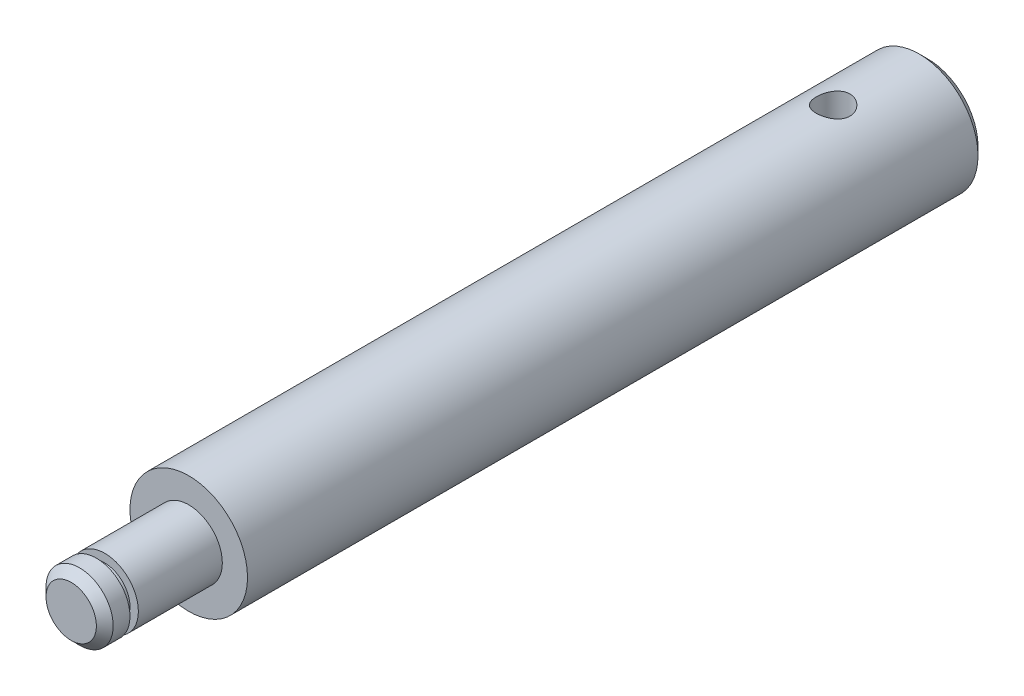
ISO-10303-21;
HEADER;
FILE_DESCRIPTION(('STEP AP214'),'2;1');
FILE_NAME('part.step','',(''),(''),'','','');
FILE_SCHEMA(('AUTOMOTIVE_DESIGN { 1 0 10303 214 1 1 1 1 }'));
ENDSEC;
DATA;
#1=APPLICATION_CONTEXT('core data for automotive mechanical design processes');
#2=APPLICATION_PROTOCOL_DEFINITION('international standard','automotive_design',2000,#1);
#3=PRODUCT_CONTEXT('',#1,'mechanical');
#4=PRODUCT('Part','Part','',(#3));
#5=PRODUCT_RELATED_PRODUCT_CATEGORY('part','',(#4));
#6=PRODUCT_DEFINITION_FORMATION('','',#4);
#7=PRODUCT_DEFINITION_CONTEXT('part definition',#1,'design');
#8=PRODUCT_DEFINITION('design','',#6,#7);
#9=PRODUCT_DEFINITION_SHAPE('','',#8);
#10=(LENGTH_UNIT() NAMED_UNIT(*) SI_UNIT(.MILLI.,.METRE.));
#11=(NAMED_UNIT(*) PLANE_ANGLE_UNIT() SI_UNIT($,.RADIAN.));
#12=(NAMED_UNIT(*) SI_UNIT($,.STERADIAN.) SOLID_ANGLE_UNIT());
#13=UNCERTAINTY_MEASURE_WITH_UNIT(LENGTH_MEASURE(1.E-05),#10,'distance_accuracy_value','');
#14=(GEOMETRIC_REPRESENTATION_CONTEXT(3) GLOBAL_UNCERTAINTY_ASSIGNED_CONTEXT((#13)) GLOBAL_UNIT_ASSIGNED_CONTEXT((#10,
#11,#12)) REPRESENTATION_CONTEXT('',''));
#15=CARTESIAN_POINT('',(0.,0.,0.));
#16=DIRECTION('',(0.,0.,1.));
#17=DIRECTION('',(1.,0.,0.));
#18=AXIS2_PLACEMENT_3D('',#15,#16,#17);
#19=CARTESIAN_POINT('',(0.,0.,44.));
#20=DIRECTION('',(0.,0.,-1.));
#21=DIRECTION('',(-1.,0.,0.));
#22=AXIS2_PLACEMENT_3D('',#19,#20,#21);
#23=CYLINDRICAL_SURFACE('',#22,3.5);
#24=CARTESIAN_POINT('',(0.,-3.5,6.62499999999999));
#25=CARTESIAN_POINT('',(0.0549774511886257,-3.49999934647171,6.62499903021902));
#26=CARTESIAN_POINT('',(0.109964873936291,-3.49869208701023,6.62045110551193));
#27=CARTESIAN_POINT('',(0.218345995598493,-3.4936045297255,6.60241786494884));
#28=CARTESIAN_POINT('',(0.271739083414806,-3.48982329605034,6.58892916696295));
#29=CARTESIAN_POINT('',(0.375352150368933,-3.48020345674544,6.55349598079174));
#30=CARTESIAN_POINT('',(0.425576440424111,-3.474367720532,6.53156328192401));
#31=CARTESIAN_POINT('',(0.521634380564631,-3.46124989158242,6.47991100426083));
#32=CARTESIAN_POINT('',(0.567467570589073,-3.45396764753901,6.45019061075485));
#33=CARTESIAN_POINT('',(0.654647223429474,-3.43852367312903,6.3829824946635));
#34=CARTESIAN_POINT('',(0.695861861190485,-3.4303452097302,6.34532762307221));
#35=CARTESIAN_POINT('',(0.77148567896215,-3.41413367457396,6.2636761284313));
#36=CARTESIAN_POINT('',(0.805893838538833,-3.40610062478085,6.21967855618443));
#37=CARTESIAN_POINT('',(0.867598950032222,-3.39091507439313,6.12550320860398));
#38=CARTESIAN_POINT('',(0.894739105517022,-3.38378351259109,6.07521900746546));
#39=CARTESIAN_POINT('',(0.940125852769608,-3.37145671914236,5.97056399412672));
#40=CARTESIAN_POINT('',(0.958374357777517,-3.36626107099664,5.9161940639724));
#41=CARTESIAN_POINT('',(0.984992165068869,-3.35856804120241,5.80638261841595));
#42=CARTESIAN_POINT('',(0.993602766016068,-3.35600489366891,5.75100431860089));
#43=CARTESIAN_POINT('',(1.00145333894794,-3.35367104182518,5.63953442575838));
#44=CARTESIAN_POINT('',(1.00069534704802,-3.35389973075334,5.58344299036685));
#45=CARTESIAN_POINT('',(0.990020673813946,-3.35706517184156,5.4740656942732));
#46=CARTESIAN_POINT('',(0.980401628641798,-3.35991391343389,5.42074782440997));
#47=CARTESIAN_POINT('',(0.95275693042909,-3.36785674196985,5.31651639018586));
#48=CARTESIAN_POINT('',(0.934730517406282,-3.37295103189706,5.26560304363966));
#49=CARTESIAN_POINT('',(0.890553405689013,-3.38488431756517,5.16687687778419));
#50=CARTESIAN_POINT('',(0.86430275586439,-3.39174458202416,5.11911146379919));
#51=CARTESIAN_POINT('',(0.804491895839429,-3.40642608441438,5.02856171939328));
#52=CARTESIAN_POINT('',(0.770930058366721,-3.41424753611068,4.98577850113254));
#53=CARTESIAN_POINT('',(0.695951998365096,-3.43033125328062,4.90471381219683));
#54=CARTESIAN_POINT('',(0.654287437422658,-3.43859902286152,4.86666276201639));
#55=CARTESIAN_POINT('',(0.565066141193109,-3.45438123609203,4.79803699817986));
#56=CARTESIAN_POINT('',(0.517509100740942,-3.46189564068921,4.76746267197915));
#57=CARTESIAN_POINT('',(0.417461536545719,-3.47538264032743,4.71453563261299));
#58=CARTESIAN_POINT('',(0.364944908904999,-3.48134637748612,4.69222985659791));
#59=CARTESIAN_POINT('',(0.256696614983732,-3.49099625743795,4.6568330542916));
#60=CARTESIAN_POINT('',(0.200965762905071,-3.49468297428128,4.64373970537737));
#61=CARTESIAN_POINT('',(0.0898331943221739,-3.49927437257336,4.62751335714528));
#62=CARTESIAN_POINT('',(0.0344806734302531,-3.50026636425301,4.6240676523135));
#63=CARTESIAN_POINT('',(-0.0760132634027908,-3.49961042353544,4.62636363315053));
#64=CARTESIAN_POINT('',(-0.131154703878552,-3.49796280790309,4.63210421642296));
#65=CARTESIAN_POINT('',(-0.238509316715158,-3.49226963342609,4.65235522215814));
#66=CARTESIAN_POINT('',(-0.290759105867426,-3.48827306508862,4.66668659066172));
#67=CARTESIAN_POINT('',(-0.392104343102812,-3.4783399937092,4.70350025099233));
#68=CARTESIAN_POINT('',(-0.441199425624334,-3.47240326632855,4.72598348544462));
#69=CARTESIAN_POINT('',(-0.536020842560034,-3.45904980584657,4.77901166832263));
#70=CARTESIAN_POINT('',(-0.581651243270123,-3.45160381589488,4.8097205994129));
#71=CARTESIAN_POINT('',(-0.66721926402965,-3.43608973548903,4.87812625297533));
#72=CARTESIAN_POINT('',(-0.70715558542121,-3.42802150376367,4.91582456503144));
#73=CARTESIAN_POINT('',(-0.781553214170348,-3.41184309815947,4.9986046710256));
#74=CARTESIAN_POINT('',(-0.815792713704764,-3.40374018433795,5.04388763778285));
#75=CARTESIAN_POINT('',(-0.876197658032574,-3.38869447362751,5.13973129430901));
#76=CARTESIAN_POINT('',(-0.902363383738848,-3.3817516363796,5.19029180037321));
#77=CARTESIAN_POINT('',(-0.945687270594165,-3.36989325638715,5.29504560549588));
#78=CARTESIAN_POINT('',(-0.96289316621221,-3.36496700079019,5.34921788178635));
#79=CARTESIAN_POINT('',(-0.987897250353697,-3.35771228398835,5.4598549678272));
#80=CARTESIAN_POINT('',(-0.995698289511603,-3.35538303564047,5.51631907755101));
#81=CARTESIAN_POINT('',(-1.00149012123095,-3.35365851547576,5.62764801646077));
#82=CARTESIAN_POINT('',(-0.999840138221134,-3.35415580399703,5.68249275227629));
#83=CARTESIAN_POINT('',(-0.987623554788207,-3.35777298607399,5.79108736533289));
#84=CARTESIAN_POINT('',(-0.977057251899594,-3.36089279211717,5.8448372790465));
#85=CARTESIAN_POINT('',(-0.947529844083134,-3.36933488579116,5.94918918558376));
#86=CARTESIAN_POINT('',(-0.928655458931756,-3.37463438524179,5.99981769350544));
#87=CARTESIAN_POINT('',(-0.883114746507961,-3.38683651421364,6.09722936724624));
#88=CARTESIAN_POINT('',(-0.85644704021577,-3.3937394274128,6.14401185063665));
#89=CARTESIAN_POINT('',(-0.795032732674117,-3.40865834474881,6.23409176090262));
#90=CARTESIAN_POINT('',(-0.760046138613649,-3.41670381589509,6.27722069567096));
#91=CARTESIAN_POINT('',(-0.683429920189671,-3.43284922546139,6.35711194790491));
#92=CARTESIAN_POINT('',(-0.641798625364273,-3.4409491770859,6.3938726595554));
#93=CARTESIAN_POINT('',(-0.551787160432689,-3.45653979786176,6.4609185921633));
#94=CARTESIAN_POINT('',(-0.503261251179884,-3.46400950518705,6.49101349363481));
#95=CARTESIAN_POINT('',(-0.401625264823326,-3.47725697888987,6.542572892511));
#96=CARTESIAN_POINT('',(-0.348517712057365,-3.48303566935144,6.56404210596653));
#97=CARTESIAN_POINT('',(-0.246458157667514,-3.49163672362654,6.59542377569772));
#98=CARTESIAN_POINT('',(-0.197881503812192,-3.49474842181038,6.60648676834227));
#99=CARTESIAN_POINT('',(-0.0995391843931819,-3.49893021926074,6.62127482862106));
#100=CARTESIAN_POINT('',(-0.0497736788080448,-3.50000059166998,6.62500087798843));
#101=CARTESIAN_POINT('',(0.,-3.5,6.62499999999999));
#102=B_SPLINE_CURVE_WITH_KNOTS('',3,(#24,#25,#26,#27,#28,#29,#30,#31,#32,#33,#34,#35,#36,#37,
#38,#39,#40,#41,#42,#43,#44,#45,#46,#47,#48,#49,#50,#51,#52,#53,#54,#55,#56,#57,#58,#59,#60,#61,
#62,#63,#64,#65,#66,#67,#68,#69,#70,#71,#72,#73,#74,#75,#76,#77,#78,#79,#80,#81,#82,#83,#84,#85,
#86,#87,#88,#89,#90,#91,#92,#93,#94,#95,#96,#97,#98,#99,#100,#101),.UNSPECIFIED.,.T.,.F.,(4,2,2,
2,2,2,2,2,2,2,2,2,2,2,2,2,2,2,2,2,2,2,2,2,2,2,2,2,2,2,2,2,2,2,2,2,2,2,4),(0.,0.164749656271171,
0.329561669897588,0.494144406447668,0.658744367717574,0.827239057653901,0.99575898936856,
1.16766537650028,1.33953475772404,1.50699754929407,1.67442394611626,1.83642392910676,
1.99843855889073,2.16250401641615,2.32660602784681,2.4968925029726,2.66718780073734,
2.83843550548233,3.00964002003315,3.17522728845109,3.34079468713333,3.50302570235768,
3.66527548283773,3.83103762668234,3.99683751589902,4.16806052438175,4.33927757478657,
4.50957286677745,4.67981652887077,4.84363340801446,5.00744482086199,5.16958548138841,
5.33175484991997,5.4993382843839,5.66696391547445,5.8388898947829,6.01072174610252,
6.15989734012181,6.30905297207067),.UNSPECIFIED.);
#103=CARTESIAN_POINT('',(0.,-3.5,6.62499999999999));
#104=VERTEX_POINT('',#103);
#105=EDGE_CURVE('E10',#104,#104,#102,.T.);
#106=ORIENTED_EDGE('',*,*,#105,.T.);
#107=EDGE_LOOP('',(#106));
#108=FACE_BOUND('',#107,.T.);
#109=CARTESIAN_POINT('',(0.,3.5,6.62499999999999));
#110=CARTESIAN_POINT('',(-0.0549774511886252,3.49999934647171,6.62499903021902));
#111=CARTESIAN_POINT('',(-0.10996487393629,3.49869208701023,6.62045110551193));
#112=CARTESIAN_POINT('',(-0.218345995598493,3.4936045297255,6.60241786494884));
#113=CARTESIAN_POINT('',(-0.271739083414805,3.48982329605034,6.58892916696295));
#114=CARTESIAN_POINT('',(-0.375352150368933,3.48020345674544,6.55349598079174));
#115=CARTESIAN_POINT('',(-0.42557644042411,3.474367720532,6.53156328192401));
#116=CARTESIAN_POINT('',(-0.52163438056463,3.46124989158242,6.47991100426083));
#117=CARTESIAN_POINT('',(-0.567467570589073,3.45396764753901,6.45019061075485));
#118=CARTESIAN_POINT('',(-0.654647223429473,3.43852367312903,6.3829824946635));
#119=CARTESIAN_POINT('',(-0.695861861190484,3.4303452097302,6.34532762307221));
#120=CARTESIAN_POINT('',(-0.771485678962149,3.41413367457396,6.2636761284313));
#121=CARTESIAN_POINT('',(-0.805893838538832,3.40610062478085,6.21967855618443));
#122=CARTESIAN_POINT('',(-0.867598950032221,3.39091507439313,6.12550320860398));
#123=CARTESIAN_POINT('',(-0.894739105517021,3.38378351259109,6.07521900746546));
#124=CARTESIAN_POINT('',(-0.940125852769607,3.37145671914236,5.97056399412672));
#125=CARTESIAN_POINT('',(-0.958374357777516,3.36626107099664,5.9161940639724));
#126=CARTESIAN_POINT('',(-0.984992165068868,3.35856804120241,5.80638261841595));
#127=CARTESIAN_POINT('',(-0.993602766016067,3.35600489366891,5.75100431860089));
#128=CARTESIAN_POINT('',(-1.00145333894794,3.35367104182518,5.63953442575838));
#129=CARTESIAN_POINT('',(-1.00069534704802,3.35389973075334,5.58344299036685));
#130=CARTESIAN_POINT('',(-0.990020673813944,3.35706517184156,5.4740656942732));
#131=CARTESIAN_POINT('',(-0.980401628641797,3.35991391343389,5.42074782440997));
#132=CARTESIAN_POINT('',(-0.952756930429089,3.36785674196985,5.31651639018586));
#133=CARTESIAN_POINT('',(-0.934730517406281,3.37295103189706,5.26560304363966));
#134=CARTESIAN_POINT('',(-0.890553405689012,3.38488431756517,5.16687687778419));
#135=CARTESIAN_POINT('',(-0.864302755864389,3.39174458202416,5.11911146379919));
#136=CARTESIAN_POINT('',(-0.804491895839428,3.40642608441438,5.02856171939328));
#137=CARTESIAN_POINT('',(-0.770930058366721,3.41424753611068,4.98577850113254));
#138=CARTESIAN_POINT('',(-0.695951998365096,3.43033125328062,4.90471381219683));
#139=CARTESIAN_POINT('',(-0.654287437422658,3.43859902286152,4.86666276201639));
#140=CARTESIAN_POINT('',(-0.565066141193109,3.45438123609203,4.79803699817986));
#141=CARTESIAN_POINT('',(-0.517509100740942,3.46189564068921,4.76746267197915));
#142=CARTESIAN_POINT('',(-0.417461536545719,3.47538264032743,4.71453563261299));
#143=CARTESIAN_POINT('',(-0.364944908904999,3.48134637748612,4.69222985659791));
#144=CARTESIAN_POINT('',(-0.256696614983732,3.49099625743795,4.6568330542916));
#145=CARTESIAN_POINT('',(-0.200965762905071,3.49468297428128,4.64373970537737));
#146=CARTESIAN_POINT('',(-0.0898331943221731,3.49927437257336,4.62751335714528));
#147=CARTESIAN_POINT('',(-0.0344806734302523,3.50026636425301,4.6240676523135));
#148=CARTESIAN_POINT('',(0.0760132634027915,3.49961042353544,4.62636363315053));
#149=CARTESIAN_POINT('',(0.131154703878552,3.49796280790309,4.63210421642296));
#150=CARTESIAN_POINT('',(0.238509316715158,3.49226963342609,4.65235522215814));
#151=CARTESIAN_POINT('',(0.290759105867426,3.48827306508862,4.66668659066172));
#152=CARTESIAN_POINT('',(0.392104343102813,3.4783399937092,4.70350025099233));
#153=CARTESIAN_POINT('',(0.441199425624335,3.47240326632854,4.72598348544461));
#154=CARTESIAN_POINT('',(0.536020842560035,3.45904980584657,4.77901166832263));
#155=CARTESIAN_POINT('',(0.581651243270124,3.45160381589488,4.8097205994129));
#156=CARTESIAN_POINT('',(0.667219264029651,3.43608973548903,4.87812625297533));
#157=CARTESIAN_POINT('',(0.70715558542121,3.42802150376367,4.91582456503144));
#158=CARTESIAN_POINT('',(0.781553214170348,3.41184309815947,4.9986046710256));
#159=CARTESIAN_POINT('',(0.815792713704765,3.40374018433795,5.04388763778285));
#160=CARTESIAN_POINT('',(0.876197658032575,3.38869447362751,5.13973129430901));
#161=CARTESIAN_POINT('',(0.902363383738849,3.3817516363796,5.19029180037321));
#162=CARTESIAN_POINT('',(0.945687270594166,3.36989325638715,5.29504560549588));
#163=CARTESIAN_POINT('',(0.96289316621221,3.36496700079018,5.34921788178635));
#164=CARTESIAN_POINT('',(0.987897250353698,3.35771228398835,5.4598549678272));
#165=CARTESIAN_POINT('',(0.995698289511604,3.35538303564047,5.51631907755101));
#166=CARTESIAN_POINT('',(1.00149012123095,3.35365851547576,5.62764801646077));
#167=CARTESIAN_POINT('',(0.999840138221135,3.35415580399703,5.68249275227629));
#168=CARTESIAN_POINT('',(0.987623554788208,3.35777298607399,5.79108736533289));
#169=CARTESIAN_POINT('',(0.977057251899595,3.36089279211717,5.8448372790465));
#170=CARTESIAN_POINT('',(0.947529844083135,3.36933488579116,5.94918918558376));
#171=CARTESIAN_POINT('',(0.928655458931757,3.37463438524179,5.99981769350544));
#172=CARTESIAN_POINT('',(0.883114746507963,3.38683651421364,6.09722936724624));
#173=CARTESIAN_POINT('',(0.856447040215771,3.3937394274128,6.14401185063665));
#174=CARTESIAN_POINT('',(0.795032732674118,3.40865834474881,6.23409176090262));
#175=CARTESIAN_POINT('',(0.76004613861365,3.41670381589509,6.27722069567096));
#176=CARTESIAN_POINT('',(0.683429920189673,3.43284922546139,6.35711194790491));
#177=CARTESIAN_POINT('',(0.641798625364275,3.4409491770859,6.3938726595554));
#178=CARTESIAN_POINT('',(0.551787160432691,3.45653979786176,6.4609185921633));
#179=CARTESIAN_POINT('',(0.503261251179886,3.46400950518705,6.49101349363481));
#180=CARTESIAN_POINT('',(0.401625264823327,3.47725697888987,6.542572892511));
#181=CARTESIAN_POINT('',(0.348517712057366,3.48303566935144,6.56404210596653));
#182=CARTESIAN_POINT('',(0.246458157667515,3.49163672362654,6.59542377569772));
#183=CARTESIAN_POINT('',(0.197881503812193,3.49474842181038,6.60648676834227));
#184=CARTESIAN_POINT('',(0.0995391843931827,3.49893021926074,6.62127482862106));
#185=CARTESIAN_POINT('',(0.0497736788080455,3.50000059166998,6.62500087798843));
#186=CARTESIAN_POINT('',(0.,3.5,6.62499999999999));
#187=B_SPLINE_CURVE_WITH_KNOTS('',3,(#109,#110,#111,#112,#113,#114,#115,#116,#117,#118,#119,
#120,#121,#122,#123,#124,#125,#126,#127,#128,#129,#130,#131,#132,#133,#134,#135,#136,#137,#138,
#139,#140,#141,#142,#143,#144,#145,#146,#147,#148,#149,#150,#151,#152,#153,#154,#155,#156,#157,
#158,#159,#160,#161,#162,#163,#164,#165,#166,#167,#168,#169,#170,#171,#172,#173,#174,#175,#176,
#177,#178,#179,#180,#181,#182,#183,#184,#185,#186),.UNSPECIFIED.,.T.,.F.,(4,2,2,2,2,2,2,2,2,2,2,
2,2,2,2,2,2,2,2,2,2,2,2,2,2,2,2,2,2,2,2,2,2,2,2,2,2,2,4),(0.,0.164749656271171,
0.329561669897588,0.494144406447667,0.658744367717574,0.827239057653901,0.99575898936856,
1.16766537650028,1.33953475772404,1.50699754929407,1.67442394611626,1.83642392910676,
1.99843855889073,2.16250401641614,2.32660602784681,2.4968925029726,2.66718780073733,
2.83843550548233,3.00964002003315,3.17522728845109,3.34079468713333,3.50302570235768,
3.66527548283773,3.83103762668234,3.99683751589902,4.16806052438175,4.33927757478657,
4.50957286677745,4.67981652887077,4.84363340801446,5.00744482086199,5.16958548138841,
5.33175484991997,5.4993382843839,5.66696391547445,5.8388898947829,6.01072174610252,
6.15989734012181,6.30905297207067),.UNSPECIFIED.);
#188=CARTESIAN_POINT('',(0.,3.5,6.62499999999999));
#189=VERTEX_POINT('',#188);
#190=EDGE_CURVE('E64',#189,#189,#187,.T.);
#191=ORIENTED_EDGE('',*,*,#190,.T.);
#192=EDGE_LOOP('',(#191));
#193=FACE_BOUND('',#192,.T.);
#194=CARTESIAN_POINT('',(0.,0.,0.5));
#195=DIRECTION('',(0.,0.,1.));
#196=DIRECTION('',(1.,0.,0.));
#197=AXIS2_PLACEMENT_3D('',#194,#195,#196);
#198=CIRCLE('',#197,3.5);
#199=CARTESIAN_POINT('',(3.5,0.,0.5));
#200=VERTEX_POINT('',#199);
#201=EDGE_CURVE('E72',#200,#200,#198,.T.);
#202=ORIENTED_EDGE('',*,*,#201,.T.);
#203=EDGE_LOOP('',(#202));
#204=FACE_BOUND('',#203,.T.);
#205=CARTESIAN_POINT('',(0.,0.,44.));
#206=DIRECTION('',(0.,0.,1.));
#207=DIRECTION('',(1.,0.,0.));
#208=AXIS2_PLACEMENT_3D('',#205,#206,#207);
#209=CIRCLE('',#208,3.5);
#210=CARTESIAN_POINT('',(3.5,0.,44.));
#211=VERTEX_POINT('',#210);
#212=EDGE_CURVE('E131',#211,#211,#209,.T.);
#213=ORIENTED_EDGE('',*,*,#212,.F.);
#214=EDGE_LOOP('',(#213));
#215=FACE_BOUND('',#214,.T.);
#216=ADVANCED_FACE('F51',(#108,#193,#204,#215),#23,.T.);
#217=CARTESIAN_POINT('',(0.,0.,44.));
#218=DIRECTION('',(0.,0.,1.));
#219=DIRECTION('',(1.,0.,0.));
#220=AXIS2_PLACEMENT_3D('',#217,#218,#219);
#221=PLANE('',#220);
#222=CARTESIAN_POINT('',(0.,0.,44.));
#223=DIRECTION('',(0.,0.,1.));
#224=DIRECTION('',(1.,0.,0.));
#225=AXIS2_PLACEMENT_3D('',#222,#223,#224);
#226=CIRCLE('',#225,2.);
#227=CARTESIAN_POINT('',(2.,0.,44.));
#228=VERTEX_POINT('',#227);
#229=EDGE_CURVE('E133',#228,#228,#226,.T.);
#230=ORIENTED_EDGE('',*,*,#229,.F.);
#231=EDGE_LOOP('',(#230));
#232=FACE_BOUND('',#231,.T.);
#233=ORIENTED_EDGE('',*,*,#212,.T.);
#234=EDGE_LOOP('',(#233));
#235=FACE_BOUND('',#234,.T.);
#236=ADVANCED_FACE('F112',(#232,#235),#221,.T.);
#237=CARTESIAN_POINT('',(0.,0.,0.));
#238=DIRECTION('',(0.,0.,1.));
#239=DIRECTION('',(1.,0.,0.));
#240=AXIS2_PLACEMENT_3D('',#237,#238,#239);
#241=PLANE('',#240);
#242=CARTESIAN_POINT('',(0.,0.,0.));
#243=DIRECTION('',(0.,0.,1.));
#244=DIRECTION('',(1.,0.,0.));
#245=AXIS2_PLACEMENT_3D('',#242,#243,#244);
#246=CIRCLE('',#245,3.);
#247=CARTESIAN_POINT('',(3.,0.,0.));
#248=VERTEX_POINT('',#247);
#249=EDGE_CURVE('E68',#248,#248,#246,.F.);
#250=ORIENTED_EDGE('',*,*,#249,.T.);
#251=EDGE_LOOP('',(#250));
#252=FACE_BOUND('',#251,.T.);
#253=ADVANCED_FACE('F110',(#252),#241,.F.);
#254=CARTESIAN_POINT('',(0.,0.,49.));
#255=DIRECTION('',(0.,0.,-1.));
#256=DIRECTION('',(-1.,0.,0.));
#257=AXIS2_PLACEMENT_3D('',#254,#255,#256);
#258=CYLINDRICAL_SURFACE('',#257,2.);
#259=CARTESIAN_POINT('',(0.,0.,49.));
#260=DIRECTION('',(0.,0.,1.));
#261=DIRECTION('',(1.,0.,0.));
#262=AXIS2_PLACEMENT_3D('',#259,#260,#261);
#263=CIRCLE('',#262,2.);
#264=CARTESIAN_POINT('',(2.,0.,49.));
#265=VERTEX_POINT('',#264);
#266=EDGE_CURVE('E134',#265,#265,#263,.T.);
#267=ORIENTED_EDGE('',*,*,#266,.F.);
#268=EDGE_LOOP('',(#267));
#269=FACE_BOUND('',#268,.T.);
#270=ORIENTED_EDGE('',*,*,#229,.T.);
#271=EDGE_LOOP('',(#270));
#272=FACE_BOUND('',#271,.T.);
#273=ADVANCED_FACE('F106',(#269,#272),#258,.T.);
#274=CARTESIAN_POINT('',(0.,0.,49.));
#275=DIRECTION('',(0.,0.,1.));
#276=DIRECTION('',(1.,0.,0.));
#277=AXIS2_PLACEMENT_3D('',#274,#275,#276);
#278=PLANE('',#277);
#279=CARTESIAN_POINT('',(0.,0.,49.));
#280=DIRECTION('',(0.,0.,1.));
#281=DIRECTION('',(1.,0.,0.));
#282=AXIS2_PLACEMENT_3D('',#279,#280,#281);
#283=CIRCLE('',#282,1.5);
#284=CARTESIAN_POINT('',(1.5,0.,49.));
#285=VERTEX_POINT('',#284);
#286=EDGE_CURVE('E137',#285,#285,#283,.T.);
#287=ORIENTED_EDGE('',*,*,#286,.F.);
#288=EDGE_LOOP('',(#287));
#289=FACE_BOUND('',#288,.T.);
#290=ORIENTED_EDGE('',*,*,#266,.T.);
#291=EDGE_LOOP('',(#290));
#292=FACE_BOUND('',#291,.T.);
#293=ADVANCED_FACE('F102',(#289,#292),#278,.T.);
#294=CARTESIAN_POINT('',(0.,0.,49.5));
#295=DIRECTION('',(0.,0.,-1.));
#296=DIRECTION('',(-1.,0.,0.));
#297=AXIS2_PLACEMENT_3D('',#294,#295,#296);
#298=CYLINDRICAL_SURFACE('',#297,1.5);
#299=CARTESIAN_POINT('',(0.,0.,49.5));
#300=DIRECTION('',(0.,0.,1.));
#301=DIRECTION('',(1.,0.,0.));
#302=AXIS2_PLACEMENT_3D('',#299,#300,#301);
#303=CIRCLE('',#302,1.5);
#304=CARTESIAN_POINT('',(1.5,0.,49.5));
#305=VERTEX_POINT('',#304);
#306=EDGE_CURVE('E140',#305,#305,#303,.T.);
#307=ORIENTED_EDGE('',*,*,#306,.F.);
#308=EDGE_LOOP('',(#307));
#309=FACE_BOUND('',#308,.T.);
#310=ORIENTED_EDGE('',*,*,#286,.T.);
#311=EDGE_LOOP('',(#310));
#312=FACE_BOUND('',#311,.T.);
#313=ADVANCED_FACE('F98',(#309,#312),#298,.T.);
#314=CARTESIAN_POINT('',(0.,0.,51.));
#315=DIRECTION('',(0.,0.,-1.));
#316=DIRECTION('',(-1.,0.,0.));
#317=AXIS2_PLACEMENT_3D('',#314,#315,#316);
#318=CYLINDRICAL_SURFACE('',#317,2.);
#319=CARTESIAN_POINT('',(0.,0.,50.5));
#320=DIRECTION('',(0.,0.,1.));
#321=DIRECTION('',(1.,0.,0.));
#322=AXIS2_PLACEMENT_3D('',#319,#320,#321);
#323=CIRCLE('',#322,2.);
#324=CARTESIAN_POINT('',(2.,0.,50.5));
#325=VERTEX_POINT('',#324);
#326=EDGE_CURVE('E146',#325,#325,#323,.F.);
#327=ORIENTED_EDGE('',*,*,#326,.T.);
#328=EDGE_LOOP('',(#327));
#329=FACE_BOUND('',#328,.T.);
#330=CARTESIAN_POINT('',(0.,0.,49.5));
#331=DIRECTION('',(0.,0.,1.));
#332=DIRECTION('',(1.,0.,0.));
#333=AXIS2_PLACEMENT_3D('',#330,#331,#332);
#334=CIRCLE('',#333,2.);
#335=CARTESIAN_POINT('',(2.,0.,49.5));
#336=VERTEX_POINT('',#335);
#337=EDGE_CURVE('E240',#336,#336,#334,.T.);
#338=ORIENTED_EDGE('',*,*,#337,.T.);
#339=EDGE_LOOP('',(#338));
#340=FACE_BOUND('',#339,.T.);
#341=ADVANCED_FACE('F90',(#329,#340),#318,.T.);
#342=CARTESIAN_POINT('',(0.,0.,51.));
#343=DIRECTION('',(0.,0.,1.));
#344=DIRECTION('',(1.,0.,0.));
#345=AXIS2_PLACEMENT_3D('',#342,#343,#344);
#346=PLANE('',#345);
#347=CARTESIAN_POINT('',(0.,0.,51.));
#348=DIRECTION('',(0.,0.,1.));
#349=DIRECTION('',(1.,0.,0.));
#350=AXIS2_PLACEMENT_3D('',#347,#348,#349);
#351=CIRCLE('',#350,1.5);
#352=CARTESIAN_POINT('',(1.5,0.,51.));
#353=VERTEX_POINT('',#352);
#354=EDGE_CURVE('E143',#353,#353,#351,.T.);
#355=ORIENTED_EDGE('',*,*,#354,.T.);
#356=EDGE_LOOP('',(#355));
#357=FACE_BOUND('',#356,.T.);
#358=ADVANCED_FACE('F85',(#357),#346,.T.);
#359=CARTESIAN_POINT('',(0.,0.,49.5));
#360=DIRECTION('',(0.,0.,1.));
#361=DIRECTION('',(1.,0.,0.));
#362=AXIS2_PLACEMENT_3D('',#359,#360,#361);
#363=PLANE('',#362);
#364=ORIENTED_EDGE('',*,*,#306,.T.);
#365=EDGE_LOOP('',(#364));
#366=FACE_BOUND('',#365,.T.);
#367=ORIENTED_EDGE('',*,*,#337,.F.);
#368=EDGE_LOOP('',(#367));
#369=FACE_BOUND('',#368,.T.);
#370=ADVANCED_FACE('F89',(#366,#369),#363,.F.);
#371=CARTESIAN_POINT('',(0.,0.,51.));
#372=DIRECTION('',(0.,0.,-1.));
#373=DIRECTION('',(-1.,0.,0.));
#374=AXIS2_PLACEMENT_3D('',#371,#372,#373);
#375=CONICAL_SURFACE('',#374,1.5,0.78539816339744);
#376=ORIENTED_EDGE('',*,*,#326,.F.);
#377=EDGE_LOOP('',(#376));
#378=FACE_BOUND('',#377,.T.);
#379=ORIENTED_EDGE('',*,*,#354,.F.);
#380=EDGE_LOOP('',(#379));
#381=FACE_BOUND('',#380,.T.);
#382=ADVANCED_FACE('F94',(#378,#381),#375,.T.);
#383=CARTESIAN_POINT('',(0.,0.,0.5));
#384=DIRECTION('',(0.,0.,1.));
#385=DIRECTION('',(1.,0.,0.));
#386=AXIS2_PLACEMENT_3D('',#383,#384,#385);
#387=CONICAL_SURFACE('',#386,3.5,0.785398163397446);
#388=ORIENTED_EDGE('',*,*,#249,.F.);
#389=EDGE_LOOP('',(#388));
#390=FACE_BOUND('',#389,.T.);
#391=ORIENTED_EDGE('',*,*,#201,.F.);
#392=EDGE_LOOP('',(#391));
#393=FACE_BOUND('',#392,.T.);
#394=ADVANCED_FACE('F54',(#390,#393),#387,.T.);
#395=CARTESIAN_POINT('',(0.,3.5,5.625));
#396=DIRECTION('',(0.,1.,0.));
#397=DIRECTION('',(0.,0.,1.));
#398=AXIS2_PLACEMENT_3D('',#395,#396,#397);
#399=CYLINDRICAL_SURFACE('',#398,0.999999999999993);
#400=ORIENTED_EDGE('',*,*,#190,.F.);
#401=EDGE_LOOP('',(#400));
#402=FACE_BOUND('',#401,.T.);
#403=ORIENTED_EDGE('',*,*,#105,.F.);
#404=EDGE_LOOP('',(#403));
#405=FACE_BOUND('',#404,.T.);
#406=ADVANCED_FACE('F80',(#402,#405),#399,.F.);
#407=CLOSED_SHELL('',(#216,#236,#253,#273,#293,#313,#341,#358,#370,#382,#394,#406));
#408=MANIFOLD_SOLID_BREP('B2',#407);
#409=ADVANCED_BREP_SHAPE_REPRESENTATION('',(#18,#408),#14);
#410=SHAPE_DEFINITION_REPRESENTATION(#9,#409);
ENDSEC;
END-ISO-10303-21;
